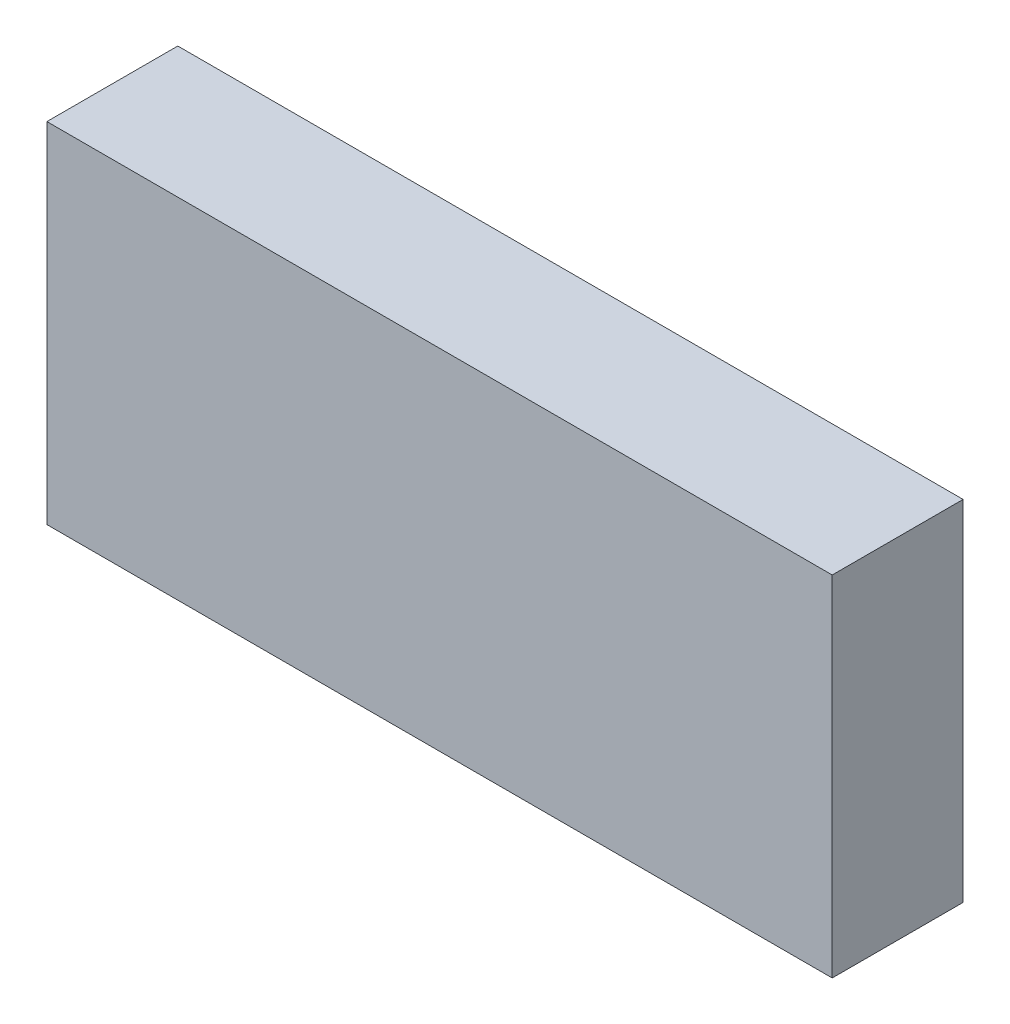
ISO-10303-21;
HEADER;
FILE_DESCRIPTION(('STEP AP214'),'2;1');
FILE_NAME('part.step','',(''),(''),'','','');
FILE_SCHEMA(('AUTOMOTIVE_DESIGN { 1 0 10303 214 1 1 1 1 }'));
ENDSEC;
DATA;
#1=APPLICATION_CONTEXT('core data for automotive mechanical design processes');
#2=APPLICATION_PROTOCOL_DEFINITION('international standard','automotive_design',2000,#1);
#3=PRODUCT_CONTEXT('',#1,'mechanical');
#4=PRODUCT('Part','Part','',(#3));
#5=PRODUCT_RELATED_PRODUCT_CATEGORY('part','',(#4));
#6=PRODUCT_DEFINITION_FORMATION('','',#4);
#7=PRODUCT_DEFINITION_CONTEXT('part definition',#1,'design');
#8=PRODUCT_DEFINITION('design','',#6,#7);
#9=PRODUCT_DEFINITION_SHAPE('','',#8);
#10=(LENGTH_UNIT() NAMED_UNIT(*) SI_UNIT(.MILLI.,.METRE.));
#11=(NAMED_UNIT(*) PLANE_ANGLE_UNIT() SI_UNIT($,.RADIAN.));
#12=(NAMED_UNIT(*) SI_UNIT($,.STERADIAN.) SOLID_ANGLE_UNIT());
#13=UNCERTAINTY_MEASURE_WITH_UNIT(LENGTH_MEASURE(1.E-05),#10,'distance_accuracy_value','');
#14=(GEOMETRIC_REPRESENTATION_CONTEXT(3) GLOBAL_UNCERTAINTY_ASSIGNED_CONTEXT((#13)) GLOBAL_UNIT_ASSIGNED_CONTEXT((#10,
#11,#12)) REPRESENTATION_CONTEXT('',''));
#15=CARTESIAN_POINT('',(0.,0.,0.));
#16=DIRECTION('',(0.,0.,1.));
#17=DIRECTION('',(1.,0.,0.));
#18=AXIS2_PLACEMENT_3D('',#15,#16,#17);
#19=CARTESIAN_POINT('',(0.,0.,150.));
#20=DIRECTION('',(1.,0.,0.));
#21=DIRECTION('',(0.,0.,-1.));
#22=AXIS2_PLACEMENT_3D('',#19,#20,#21);
#23=PLANE('',#22);
#24=DIRECTION('',(0.,-1.,0.));
#25=VECTOR('',#24,1.);
#26=CARTESIAN_POINT('',(0.,0.,0.));
#27=LINE('',#26,#25);
#28=CARTESIAN_POINT('',(0.,400.,0.));
#29=VERTEX_POINT('',#28);
#30=CARTESIAN_POINT('',(0.,0.,0.));
#31=VERTEX_POINT('',#30);
#32=EDGE_CURVE('E97',#29,#31,#27,.T.);
#33=ORIENTED_EDGE('',*,*,#32,.T.);
#34=DIRECTION('',(0.,0.,-1.));
#35=VECTOR('',#34,1.);
#36=CARTESIAN_POINT('',(0.,0.,150.));
#37=LINE('',#36,#35);
#38=CARTESIAN_POINT('',(0.,0.,150.));
#39=VERTEX_POINT('',#38);
#40=EDGE_CURVE('E11',#39,#31,#37,.T.);
#41=ORIENTED_EDGE('',*,*,#40,.F.);
#42=DIRECTION('',(0.,-1.,0.));
#43=VECTOR('',#42,1.);
#44=CARTESIAN_POINT('',(0.,0.,150.));
#45=LINE('',#44,#43);
#46=CARTESIAN_POINT('',(0.,400.,150.));
#47=VERTEX_POINT('',#46);
#48=EDGE_CURVE('E85',#47,#39,#45,.T.);
#49=ORIENTED_EDGE('',*,*,#48,.F.);
#50=DIRECTION('',(0.,0.,-1.));
#51=VECTOR('',#50,1.);
#52=CARTESIAN_POINT('',(0.,400.,150.));
#53=LINE('',#52,#51);
#54=EDGE_CURVE('E93',#47,#29,#53,.T.);
#55=ORIENTED_EDGE('',*,*,#54,.T.);
#56=EDGE_LOOP('',(#33,#41,#49,#55));
#57=FACE_BOUND('',#56,.T.);
#58=ADVANCED_FACE('F34',(#57),#23,.F.);
#59=CARTESIAN_POINT('',(0.,0.,150.));
#60=DIRECTION('',(0.,1.,0.));
#61=DIRECTION('',(0.,0.,1.));
#62=AXIS2_PLACEMENT_3D('',#59,#60,#61);
#63=PLANE('',#62);
#64=DIRECTION('',(1.,0.,0.));
#65=VECTOR('',#64,1.);
#66=CARTESIAN_POINT('',(0.,0.,0.));
#67=LINE('',#66,#65);
#68=CARTESIAN_POINT('',(900.,0.,0.));
#69=VERTEX_POINT('',#68);
#70=EDGE_CURVE('E89',#31,#69,#67,.T.);
#71=ORIENTED_EDGE('',*,*,#70,.T.);
#72=DIRECTION('',(0.,0.,-1.));
#73=VECTOR('',#72,1.);
#74=CARTESIAN_POINT('',(900.,0.,150.));
#75=LINE('',#74,#73);
#76=CARTESIAN_POINT('',(900.,0.,150.));
#77=VERTEX_POINT('',#76);
#78=EDGE_CURVE('E42',#77,#69,#75,.T.);
#79=ORIENTED_EDGE('',*,*,#78,.F.);
#80=DIRECTION('',(1.,0.,0.));
#81=VECTOR('',#80,1.);
#82=CARTESIAN_POINT('',(0.,0.,150.));
#83=LINE('',#82,#81);
#84=EDGE_CURVE('E80',#39,#77,#83,.T.);
#85=ORIENTED_EDGE('',*,*,#84,.F.);
#86=ORIENTED_EDGE('',*,*,#40,.T.);
#87=EDGE_LOOP('',(#71,#79,#85,#86));
#88=FACE_BOUND('',#87,.T.);
#89=ADVANCED_FACE('F88',(#88),#63,.F.);
#90=CARTESIAN_POINT('',(900.,0.,150.));
#91=DIRECTION('',(-1.,0.,0.));
#92=DIRECTION('',(0.,0.,1.));
#93=AXIS2_PLACEMENT_3D('',#90,#91,#92);
#94=PLANE('',#93);
#95=DIRECTION('',(0.,1.,0.));
#96=VECTOR('',#95,1.);
#97=CARTESIAN_POINT('',(900.,0.,0.));
#98=LINE('',#97,#96);
#99=CARTESIAN_POINT('',(900.,400.,0.));
#100=VERTEX_POINT('',#99);
#101=EDGE_CURVE('E67',#69,#100,#98,.T.);
#102=ORIENTED_EDGE('',*,*,#101,.T.);
#103=DIRECTION('',(0.,0.,-1.));
#104=VECTOR('',#103,1.);
#105=CARTESIAN_POINT('',(900.,400.,150.));
#106=LINE('',#105,#104);
#107=CARTESIAN_POINT('',(900.,400.,150.));
#108=VERTEX_POINT('',#107);
#109=EDGE_CURVE('E90',#108,#100,#106,.T.);
#110=ORIENTED_EDGE('',*,*,#109,.F.);
#111=DIRECTION('',(0.,1.,0.));
#112=VECTOR('',#111,1.);
#113=CARTESIAN_POINT('',(900.,0.,150.));
#114=LINE('',#113,#112);
#115=EDGE_CURVE('E83',#77,#108,#114,.T.);
#116=ORIENTED_EDGE('',*,*,#115,.F.);
#117=ORIENTED_EDGE('',*,*,#78,.T.);
#118=EDGE_LOOP('',(#102,#110,#116,#117));
#119=FACE_BOUND('',#118,.T.);
#120=ADVANCED_FACE('F91',(#119),#94,.F.);
#121=CARTESIAN_POINT('',(0.,400.,150.));
#122=DIRECTION('',(0.,-1.,0.));
#123=DIRECTION('',(0.,0.,-1.));
#124=AXIS2_PLACEMENT_3D('',#121,#122,#123);
#125=PLANE('',#124);
#126=DIRECTION('',(-1.,0.,0.));
#127=VECTOR('',#126,1.);
#128=CARTESIAN_POINT('',(0.,400.,0.));
#129=LINE('',#128,#127);
#130=EDGE_CURVE('E73',#100,#29,#129,.T.);
#131=ORIENTED_EDGE('',*,*,#130,.T.);
#132=ORIENTED_EDGE('',*,*,#54,.F.);
#133=DIRECTION('',(-1.,0.,0.));
#134=VECTOR('',#133,1.);
#135=CARTESIAN_POINT('',(0.,400.,150.));
#136=LINE('',#135,#134);
#137=EDGE_CURVE('E50',#108,#47,#136,.T.);
#138=ORIENTED_EDGE('',*,*,#137,.F.);
#139=ORIENTED_EDGE('',*,*,#109,.T.);
#140=EDGE_LOOP('',(#131,#132,#138,#139));
#141=FACE_BOUND('',#140,.T.);
#142=ADVANCED_FACE('F104',(#141),#125,.F.);
#143=CARTESIAN_POINT('',(0.,0.,150.));
#144=DIRECTION('',(0.,0.,-1.));
#145=DIRECTION('',(-1.,0.,0.));
#146=AXIS2_PLACEMENT_3D('',#143,#144,#145);
#147=PLANE('',#146);
#148=ORIENTED_EDGE('',*,*,#48,.T.);
#149=ORIENTED_EDGE('',*,*,#84,.T.);
#150=ORIENTED_EDGE('',*,*,#115,.T.);
#151=ORIENTED_EDGE('',*,*,#137,.T.);
#152=EDGE_LOOP('',(#148,#149,#150,#151));
#153=FACE_BOUND('',#152,.T.);
#154=ADVANCED_FACE('F81',(#153),#147,.F.);
#155=CARTESIAN_POINT('',(0.,0.,0.));
#156=DIRECTION('',(0.,0.,-1.));
#157=DIRECTION('',(-1.,0.,0.));
#158=AXIS2_PLACEMENT_3D('',#155,#156,#157);
#159=PLANE('',#158);
#160=ORIENTED_EDGE('',*,*,#32,.F.);
#161=ORIENTED_EDGE('',*,*,#130,.F.);
#162=ORIENTED_EDGE('',*,*,#101,.F.);
#163=ORIENTED_EDGE('',*,*,#70,.F.);
#164=EDGE_LOOP('',(#160,#161,#162,#163));
#165=FACE_BOUND('',#164,.T.);
#166=ADVANCED_FACE('F107',(#165),#159,.T.);
#167=CLOSED_SHELL('',(#58,#89,#120,#142,#154,#166));
#168=MANIFOLD_SOLID_BREP('B2',#167);
#169=ADVANCED_BREP_SHAPE_REPRESENTATION('',(#18,#168),#14);
#170=SHAPE_DEFINITION_REPRESENTATION(#9,#169);
ENDSEC;
END-ISO-10303-21;
